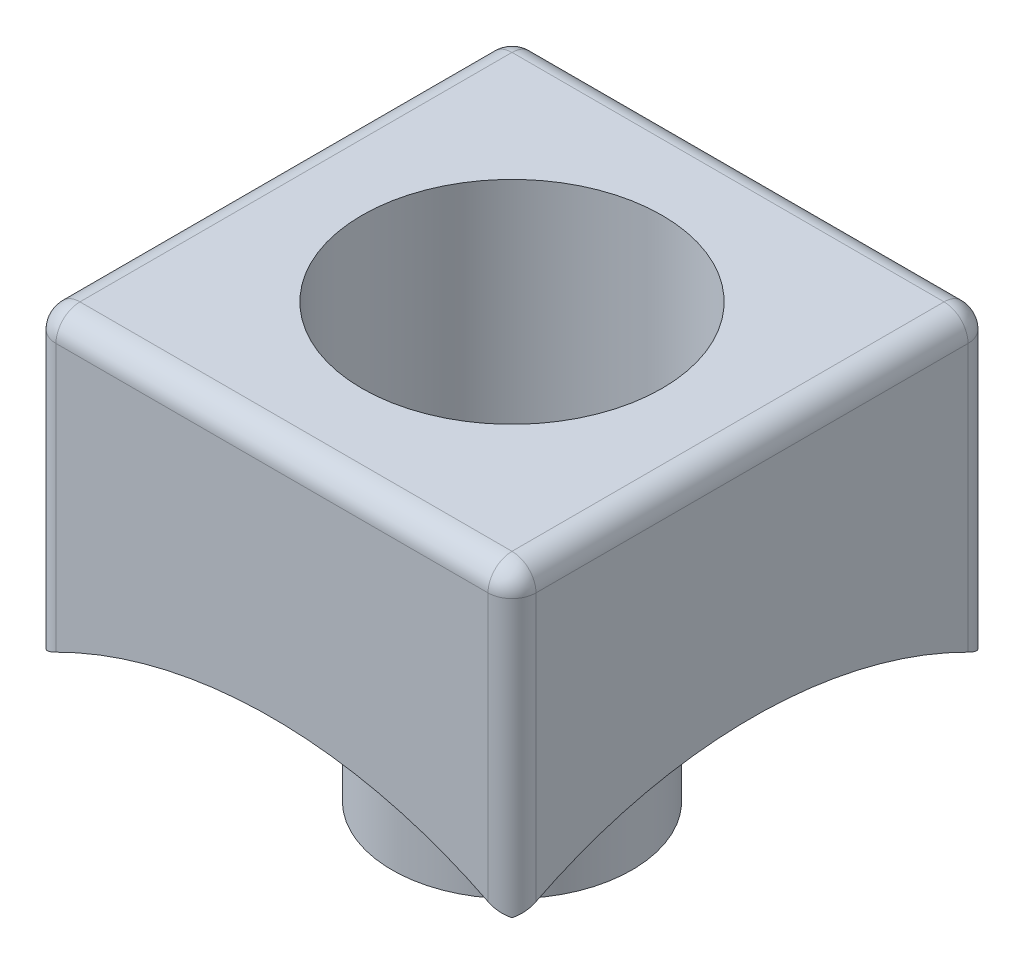
ISO-10303-21;
HEADER;
FILE_DESCRIPTION(('STEP AP214'),'2;1');
FILE_NAME('part.step','',(''),(''),'','','');
FILE_SCHEMA(('AUTOMOTIVE_DESIGN { 1 0 10303 214 1 1 1 1 }'));
ENDSEC;
DATA;
#1=APPLICATION_CONTEXT('core data for automotive mechanical design processes');
#2=APPLICATION_PROTOCOL_DEFINITION('international standard','automotive_design',2000,#1);
#3=PRODUCT_CONTEXT('',#1,'mechanical');
#4=PRODUCT('Part','Part','',(#3));
#5=PRODUCT_RELATED_PRODUCT_CATEGORY('part','',(#4));
#6=PRODUCT_DEFINITION_FORMATION('','',#4);
#7=PRODUCT_DEFINITION_CONTEXT('part definition',#1,'design');
#8=PRODUCT_DEFINITION('design','',#6,#7);
#9=PRODUCT_DEFINITION_SHAPE('','',#8);
#10=(LENGTH_UNIT() NAMED_UNIT(*) SI_UNIT(.MILLI.,.METRE.));
#11=(NAMED_UNIT(*) PLANE_ANGLE_UNIT() SI_UNIT($,.RADIAN.));
#12=(NAMED_UNIT(*) SI_UNIT($,.STERADIAN.) SOLID_ANGLE_UNIT());
#13=UNCERTAINTY_MEASURE_WITH_UNIT(LENGTH_MEASURE(1.E-05),#10,'distance_accuracy_value','');
#14=(GEOMETRIC_REPRESENTATION_CONTEXT(3) GLOBAL_UNCERTAINTY_ASSIGNED_CONTEXT((#13)) GLOBAL_UNIT_ASSIGNED_CONTEXT((#10,
#11,#12)) REPRESENTATION_CONTEXT('',''));
#15=CARTESIAN_POINT('',(0.,0.,0.));
#16=DIRECTION('',(0.,0.,1.));
#17=DIRECTION('',(1.,0.,0.));
#18=AXIS2_PLACEMENT_3D('',#15,#16,#17);
#19=CARTESIAN_POINT('',(0.,-8.00000000000001,0.));
#20=DIRECTION('',(0.,1.,0.));
#21=DIRECTION('',(0.,0.,1.));
#22=AXIS2_PLACEMENT_3D('',#19,#20,#21);
#23=CYLINDRICAL_SURFACE('',#22,7.);
#24=CARTESIAN_POINT('',(0.,8.99999999999999,0.));
#25=DIRECTION('',(0.,-1.,0.));
#26=DIRECTION('',(0.,0.,-1.));
#27=AXIS2_PLACEMENT_3D('',#24,#25,#26);
#28=CIRCLE('',#27,7.);
#29=CARTESIAN_POINT('',(0.,8.99999999999999,-7.));
#30=VERTEX_POINT('',#29);
#31=EDGE_CURVE('E189',#30,#30,#28,.T.);
#32=ORIENTED_EDGE('',*,*,#31,.T.);
#33=EDGE_LOOP('',(#32));
#34=FACE_BOUND('',#33,.T.);
#35=CARTESIAN_POINT('',(0.,-3.00000000000001,0.));
#36=DIRECTION('',(0.,-1.,0.));
#37=DIRECTION('',(0.,0.,-1.));
#38=AXIS2_PLACEMENT_3D('',#35,#36,#37);
#39=CIRCLE('',#38,7.);
#40=CARTESIAN_POINT('',(0.,-3.00000000000001,-7.));
#41=VERTEX_POINT('',#40);
#42=EDGE_CURVE('E210',#41,#41,#39,.T.);
#43=ORIENTED_EDGE('',*,*,#42,.F.);
#44=EDGE_LOOP('',(#43));
#45=FACE_BOUND('',#44,.T.);
#46=ADVANCED_FACE('F34',(#34,#45),#23,.T.);
#47=CARTESIAN_POINT('',(0.,-8.00000000000001,0.));
#48=DIRECTION('',(0.,-1.,0.));
#49=DIRECTION('',(0.,0.,-1.));
#50=AXIS2_PLACEMENT_3D('',#47,#48,#49);
#51=PLANE('',#50);
#52=CARTESIAN_POINT('',(0.,-8.00000000000001,0.));
#53=DIRECTION('',(0.,-1.,0.));
#54=DIRECTION('',(0.,0.,-1.));
#55=AXIS2_PLACEMENT_3D('',#52,#53,#54);
#56=CIRCLE('',#55,3.25);
#57=CARTESIAN_POINT('',(0.,-8.00000000000001,-3.25));
#58=VERTEX_POINT('',#57);
#59=EDGE_CURVE('E499',#58,#58,#56,.T.);
#60=ORIENTED_EDGE('',*,*,#59,.F.);
#61=EDGE_LOOP('',(#60));
#62=FACE_BOUND('',#61,.T.);
#63=CARTESIAN_POINT('',(0.,-8.00000000000001,0.));
#64=DIRECTION('',(0.,-1.,0.));
#65=DIRECTION('',(0.,0.,-1.));
#66=AXIS2_PLACEMENT_3D('',#63,#64,#65);
#67=CIRCLE('',#66,5.);
#68=CARTESIAN_POINT('',(0.,-8.00000000000001,-5.));
#69=VERTEX_POINT('',#68);
#70=EDGE_CURVE('E398',#69,#69,#67,.T.);
#71=ORIENTED_EDGE('',*,*,#70,.T.);
#72=EDGE_LOOP('',(#71));
#73=FACE_BOUND('',#72,.T.);
#74=ADVANCED_FACE('F284',(#62,#73),#51,.T.);
#75=CARTESIAN_POINT('',(10.,9.99999999999999,-10.));
#76=DIRECTION('',(0.,0.,-1.));
#77=DIRECTION('',(-1.,0.,0.));
#78=AXIS2_PLACEMENT_3D('',#75,#76,#77);
#79=PLANE('',#78);
#80=DIRECTION('',(-1.,0.,0.));
#81=VECTOR('',#80,1.);
#82=CARTESIAN_POINT('',(10.,8.99999999999999,-10.));
#83=LINE('',#82,#81);
#84=CARTESIAN_POINT('',(-8.99999999999999,8.99999999999999,-10.));
#85=VERTEX_POINT('',#84);
#86=CARTESIAN_POINT('',(9.00000000000001,8.99999999999999,-10.));
#87=VERTEX_POINT('',#86);
#88=EDGE_CURVE('E221',#85,#87,#83,.F.);
#89=ORIENTED_EDGE('',*,*,#88,.T.);
#90=DIRECTION('',(0.,1.,0.));
#91=VECTOR('',#90,1.);
#92=CARTESIAN_POINT('',(9.00000000000001,-2.67949192431123,-10.));
#93=LINE('',#92,#91);
#94=CARTESIAN_POINT('',(9.00000000000001,-2.13942890050825,-10.));
#95=VERTEX_POINT('',#94);
#96=EDGE_CURVE('E225',#87,#95,#93,.F.);
#97=ORIENTED_EDGE('',*,*,#96,.T.);
#98=CARTESIAN_POINT('',(0.,-20.,-10.));
#99=DIRECTION('',(0.,0.,1.));
#100=DIRECTION('',(1.,0.,0.));
#101=AXIS2_PLACEMENT_3D('',#98,#99,#100);
#102=CIRCLE('',#101,20.);
#103=CARTESIAN_POINT('',(-8.99999999999999,-2.13942890050825,-10.));
#104=VERTEX_POINT('',#103);
#105=EDGE_CURVE('E171',#95,#104,#102,.T.);
#106=ORIENTED_EDGE('',*,*,#105,.T.);
#107=DIRECTION('',(0.,-1.,0.));
#108=VECTOR('',#107,1.);
#109=CARTESIAN_POINT('',(-8.99999999999999,9.99999999999999,-10.));
#110=LINE('',#109,#108);
#111=EDGE_CURVE('E223',#104,#85,#110,.F.);
#112=ORIENTED_EDGE('',*,*,#111,.T.);
#113=EDGE_LOOP('',(#89,#97,#106,#112));
#114=FACE_BOUND('',#113,.T.);
#115=ADVANCED_FACE('F288',(#114),#79,.T.);
#116=CARTESIAN_POINT('',(10.,9.99999999999999,-9.));
#117=DIRECTION('',(0.,0.,-1.));
#118=DIRECTION('',(-1.,0.,0.));
#119=AXIS2_PLACEMENT_3D('',#116,#117,#118);
#120=PLANE('',#119);
#121=CARTESIAN_POINT('',(0.,-20.,-9.));
#122=DIRECTION('',(0.,0.,1.));
#123=DIRECTION('',(1.,0.,0.));
#124=AXIS2_PLACEMENT_3D('',#121,#122,#123);
#125=CIRCLE('',#124,20.);
#126=CARTESIAN_POINT('',(8.99999999999999,-2.13942890050824,-9.));
#127=VERTEX_POINT('',#126);
#128=CARTESIAN_POINT('',(-8.99999999999999,-2.13942890050825,-9.));
#129=VERTEX_POINT('',#128);
#130=EDGE_CURVE('E154',#127,#129,#125,.T.);
#131=ORIENTED_EDGE('',*,*,#130,.F.);
#132=DIRECTION('',(0.,1.,0.));
#133=VECTOR('',#132,1.);
#134=CARTESIAN_POINT('',(9.00000000000001,9.99999999999999,-9.));
#135=LINE('',#134,#133);
#136=CARTESIAN_POINT('',(9.00000000000001,8.99999999999999,-9.));
#137=VERTEX_POINT('',#136);
#138=EDGE_CURVE('E167',#127,#137,#135,.T.);
#139=ORIENTED_EDGE('',*,*,#138,.T.);
#140=DIRECTION('',(-1.,0.,0.));
#141=VECTOR('',#140,1.);
#142=CARTESIAN_POINT('',(10.,8.99999999999999,-9.));
#143=LINE('',#142,#141);
#144=CARTESIAN_POINT('',(-8.99999999999999,8.99999999999999,-9.));
#145=VERTEX_POINT('',#144);
#146=EDGE_CURVE('E188',#137,#145,#143,.T.);
#147=ORIENTED_EDGE('',*,*,#146,.T.);
#148=DIRECTION('',(0.,-1.,0.));
#149=VECTOR('',#148,1.);
#150=CARTESIAN_POINT('',(-8.99999999999999,9.99999999999999,-9.));
#151=LINE('',#150,#149);
#152=EDGE_CURVE('E170',#145,#129,#151,.T.);
#153=ORIENTED_EDGE('',*,*,#152,.T.);
#154=EDGE_LOOP('',(#131,#139,#147,#153));
#155=FACE_BOUND('',#154,.T.);
#156=ADVANCED_FACE('F165',(#155),#120,.F.);
#157=CARTESIAN_POINT('',(-8.99999999999999,-20.,0.));
#158=DIRECTION('',(-1.,0.,0.));
#159=DIRECTION('',(0.,0.,1.));
#160=AXIS2_PLACEMENT_3D('',#157,#158,#159);
#161=CYLINDRICAL_SURFACE('',#160,20.);
#162=CARTESIAN_POINT('',(0.,-20.,0.));
#163=DIRECTION('',(-0.707106781186547,0.,-0.707106781186547));
#164=DIRECTION('',(-0.707106781186547,0.,0.707106781186547));
#165=AXIS2_PLACEMENT_3D('',#162,#163,#164);
#166=ELLIPSE('',#165,28.2842712474619,20.);
#167=CARTESIAN_POINT('',(-8.99999999999999,-2.13942890050825,9.));
#168=VERTEX_POINT('',#167);
#169=CARTESIAN_POINT('',(-9.70710678118654,-2.51366024753488,9.70710678118655));
#170=VERTEX_POINT('',#169);
#171=EDGE_CURVE('E370',#168,#170,#166,.F.);
#172=ORIENTED_EDGE('',*,*,#171,.T.);
#173=CARTESIAN_POINT('',(-9.70710678118654,-2.51366024753486,9.70710678118655));
#174=CARTESIAN_POINT('',(-9.75086160467598,-2.48936640860533,9.66336275060323));
#175=CARTESIAN_POINT('',(-9.78997979575569,-2.46336652195126,9.61612306365357));
#176=CARTESIAN_POINT('',(-9.85854013435416,-2.40900351369542,9.51630002383607));
#177=CARTESIAN_POINT('',(-9.88798663335841,-2.3806414620985,9.46371908808201));
#178=CARTESIAN_POINT('',(-9.93679672235931,-2.32263176723842,9.35491739729838));
#179=CARTESIAN_POINT('',(-9.95617846424611,-2.29298654357576,9.29870340194732));
#180=CARTESIAN_POINT('',(-9.98468200107242,-2.2332562539749,9.18406019139775));
#181=CARTESIAN_POINT('',(-9.99382227351383,-2.20317207968784,9.12563516290671));
#182=CARTESIAN_POINT('',(-9.99925480292988,-2.16195339720166,9.04459700974698));
#183=CARTESIAN_POINT('',(-10.0000019589736,-2.15066702130929,9.02230408613707));
#184=CARTESIAN_POINT('',(-9.99999999999999,-2.13942890050825,9.));
#185=B_SPLINE_CURVE_WITH_KNOTS('',3,(#173,#174,#175,#176,#177,#178,#179,#180,#181,#182,#183,
#184),.UNSPECIFIED.,.F.,.F.,(4,2,2,2,2,4),(0.,0.198958979889588,0.397828321186781,
0.596337742973679,0.794488437508147,0.86943511855196),.UNSPECIFIED.);
#186=CARTESIAN_POINT('',(-9.99999999999999,-2.13942890050825,9.));
#187=VERTEX_POINT('',#186);
#188=EDGE_CURVE('E264',#170,#187,#185,.T.);
#189=ORIENTED_EDGE('',*,*,#188,.T.);
#190=CARTESIAN_POINT('',(-9.99999999999999,-20.,0.));
#191=DIRECTION('',(-1.,0.,0.));
#192=DIRECTION('',(0.,0.,1.));
#193=AXIS2_PLACEMENT_3D('',#190,#191,#192);
#194=CIRCLE('',#193,20.);
#195=CARTESIAN_POINT('',(-9.99999999999999,-2.13942890050825,-9.));
#196=VERTEX_POINT('',#195);
#197=EDGE_CURVE('E181',#187,#196,#194,.T.);
#198=ORIENTED_EDGE('',*,*,#197,.T.);
#199=CARTESIAN_POINT('',(-9.99999999999999,-2.13942890050825,-9.));
#200=CARTESIAN_POINT('',(-10.0000019412703,-2.17146812327706,-9.06361138291914));
#201=CARTESIAN_POINT('',(-9.99392879894998,-2.20386337440279,-9.12702423278765));
#202=CARTESIAN_POINT('',(-9.97024362204474,-2.26740601498298,-9.24984473152507));
#203=CARTESIAN_POINT('',(-9.95297988429877,-2.2985618770495,-9.30931540370141));
#204=CARTESIAN_POINT('',(-9.90597762284806,-2.36171143274543,-9.4284468765389));
#205=CARTESIAN_POINT('',(-9.8754883156671,-2.39362385521701,-9.4878591768244));
#206=CARTESIAN_POINT('',(-9.80133913259112,-2.45571189239321,-9.60221197232428));
#207=CARTESIAN_POINT('',(-9.75728138759686,-2.48579666051533,-9.65694286498286));
#208=CARTESIAN_POINT('',(-9.70710678118655,-2.51366024753487,-9.70710678118654));
#209=B_SPLINE_CURVE_WITH_KNOTS('',3,(#199,#200,#201,#202,#203,#204,#205,#206,#207,#208),
.UNSPECIFIED.,.F.,.F.,(4,2,2,2,4),(0.,0.213384258991516,0.420426797241797,0.641187946816178,
0.869163905662991),.UNSPECIFIED.);
#210=CARTESIAN_POINT('',(-9.70710678118654,-2.51366024753488,-9.70710678118654));
#211=VERTEX_POINT('',#210);
#212=EDGE_CURVE('E256',#196,#211,#209,.T.);
#213=ORIENTED_EDGE('',*,*,#212,.T.);
#214=CARTESIAN_POINT('',(0.,-20.,0.));
#215=DIRECTION('',(-0.707106781186547,0.,0.707106781186547));
#216=DIRECTION('',(-0.707106781186547,0.,-0.707106781186547));
#217=AXIS2_PLACEMENT_3D('',#214,#215,#216);
#218=ELLIPSE('',#217,28.2842712474619,20.);
#219=EDGE_CURVE('E161',#129,#211,#218,.T.);
#220=ORIENTED_EDGE('',*,*,#219,.F.);
#221=CARTESIAN_POINT('',(-8.99999999999999,-20.,0.));
#222=DIRECTION('',(-1.,0.,0.));
#223=DIRECTION('',(0.,0.,1.));
#224=AXIS2_PLACEMENT_3D('',#221,#222,#223);
#225=CIRCLE('',#224,20.);
#226=EDGE_CURVE('E193',#168,#129,#225,.T.);
#227=ORIENTED_EDGE('',*,*,#226,.F.);
#228=EDGE_LOOP('',(#172,#189,#198,#213,#220,#227));
#229=FACE_BOUND('',#228,.T.);
#230=ADVANCED_FACE('F277',(#229),#161,.F.);
#231=CARTESIAN_POINT('',(8.99999999999999,-20.,0.));
#232=DIRECTION('',(1.,0.,0.));
#233=DIRECTION('',(0.,0.,-1.));
#234=AXIS2_PLACEMENT_3D('',#231,#232,#233);
#235=CYLINDRICAL_SURFACE('',#234,20.);
#236=CARTESIAN_POINT('',(0.,-20.,0.));
#237=DIRECTION('',(0.707106781186547,0.,0.707106781186547));
#238=DIRECTION('',(0.707106781186547,0.,-0.707106781186547));
#239=AXIS2_PLACEMENT_3D('',#236,#237,#238);
#240=ELLIPSE('',#239,28.2842712474619,20.);
#241=CARTESIAN_POINT('',(9.70710678118656,-2.51366024753488,-9.70710678118655));
#242=VERTEX_POINT('',#241);
#243=EDGE_CURVE('E149',#127,#242,#240,.F.);
#244=ORIENTED_EDGE('',*,*,#243,.T.);
#245=CARTESIAN_POINT('',(9.70710678118656,-2.51366024753488,-9.70710678118655));
#246=CARTESIAN_POINT('',(9.75086160467599,-2.48936640860533,-9.66336275060324));
#247=CARTESIAN_POINT('',(9.7899797957557,-2.46336652195126,-9.61612306365358));
#248=CARTESIAN_POINT('',(9.85854013435416,-2.40900351369542,-9.51630002383608));
#249=CARTESIAN_POINT('',(9.88798663335842,-2.3806414620985,-9.46371908808202));
#250=CARTESIAN_POINT('',(9.93679672235933,-2.32263176723842,-9.35491739729839));
#251=CARTESIAN_POINT('',(9.95617846424612,-2.29298654357577,-9.29870340194733));
#252=CARTESIAN_POINT('',(9.98468200107244,-2.23325625397491,-9.18406019139776));
#253=CARTESIAN_POINT('',(9.99382227351384,-2.20317207968784,-9.12563516290672));
#254=CARTESIAN_POINT('',(9.9992548029299,-2.16195339720166,-9.04459700974699));
#255=CARTESIAN_POINT('',(10.0000019589736,-2.15066702130929,-9.02230408613707));
#256=CARTESIAN_POINT('',(10.,-2.13942890050825,-9.));
#257=B_SPLINE_CURVE_WITH_KNOTS('',3,(#245,#246,#247,#248,#249,#250,#251,#252,#253,#254,#255,
#256),.UNSPECIFIED.,.F.,.F.,(4,2,2,2,2,4),(0.,0.198958979889587,0.397828321186782,
0.596337742973681,0.79448843750815,0.869435118551966),.UNSPECIFIED.);
#258=CARTESIAN_POINT('',(9.99999999999999,-2.13942890050825,-9.));
#259=VERTEX_POINT('',#258);
#260=EDGE_CURVE('E336',#242,#259,#257,.T.);
#261=ORIENTED_EDGE('',*,*,#260,.T.);
#262=CARTESIAN_POINT('',(9.99999999999999,-20.,0.));
#263=DIRECTION('',(-1.,0.,0.));
#264=DIRECTION('',(0.,0.,1.));
#265=AXIS2_PLACEMENT_3D('',#262,#263,#264);
#266=CIRCLE('',#265,20.);
#267=CARTESIAN_POINT('',(9.99999999999999,-2.13942890050825,9.));
#268=VERTEX_POINT('',#267);
#269=EDGE_CURVE('E182',#268,#259,#266,.T.);
#270=ORIENTED_EDGE('',*,*,#269,.F.);
#271=CARTESIAN_POINT('',(10.,-2.13942890050825,9.));
#272=CARTESIAN_POINT('',(10.0000019412703,-2.17146812327705,9.06361138291914));
#273=CARTESIAN_POINT('',(9.99392879894999,-2.20386337440278,9.12702423278765));
#274=CARTESIAN_POINT('',(9.97024362204475,-2.26740601498298,9.24984473152507));
#275=CARTESIAN_POINT('',(9.95297988429878,-2.2985618770495,9.30931540370141));
#276=CARTESIAN_POINT('',(9.90597762284808,-2.36171143274543,9.4284468765389));
#277=CARTESIAN_POINT('',(9.87548831566711,-2.39362385521701,9.4878591768244));
#278=CARTESIAN_POINT('',(9.80133913259113,-2.4557118923932,9.60221197232428));
#279=CARTESIAN_POINT('',(9.75728138759687,-2.48579666051533,9.65694286498286));
#280=CARTESIAN_POINT('',(9.70710678118655,-2.51366024753487,9.70710678118655));
#281=B_SPLINE_CURVE_WITH_KNOTS('',3,(#271,#272,#273,#274,#275,#276,#277,#278,#279,#280),
.UNSPECIFIED.,.F.,.F.,(4,2,2,2,4),(0.,0.213384258991516,0.420426797241796,0.641187946816183,
0.869163905663004),.UNSPECIFIED.);
#282=CARTESIAN_POINT('',(9.70710678118654,-2.51366024753488,9.70710678118654));
#283=VERTEX_POINT('',#282);
#284=EDGE_CURVE('E343',#268,#283,#281,.T.);
#285=ORIENTED_EDGE('',*,*,#284,.T.);
#286=CARTESIAN_POINT('',(0.,-20.,0.));
#287=DIRECTION('',(0.707106781186547,0.,-0.707106781186547));
#288=DIRECTION('',(0.707106781186547,0.,0.707106781186547));
#289=AXIS2_PLACEMENT_3D('',#286,#287,#288);
#290=ELLIPSE('',#289,28.2842712474619,20.);
#291=CARTESIAN_POINT('',(8.99999999999999,-2.13942890050825,9.));
#292=VERTEX_POINT('',#291);
#293=EDGE_CURVE('E178',#292,#283,#290,.T.);
#294=ORIENTED_EDGE('',*,*,#293,.F.);
#295=CARTESIAN_POINT('',(8.99999999999999,-20.,0.));
#296=DIRECTION('',(-1.,0.,0.));
#297=DIRECTION('',(0.,0.,1.));
#298=AXIS2_PLACEMENT_3D('',#295,#296,#297);
#299=CIRCLE('',#298,20.);
#300=EDGE_CURVE('E175',#292,#127,#299,.T.);
#301=ORIENTED_EDGE('',*,*,#300,.T.);
#302=EDGE_LOOP('',(#244,#261,#270,#285,#294,#301));
#303=FACE_BOUND('',#302,.T.);
#304=ADVANCED_FACE('F176',(#303),#235,.F.);
#305=CARTESIAN_POINT('',(10.,-10.,10.));
#306=DIRECTION('',(-1.,0.,0.));
#307=DIRECTION('',(0.,0.,1.));
#308=AXIS2_PLACEMENT_3D('',#305,#306,#307);
#309=PLANE('',#308);
#310=ORIENTED_EDGE('',*,*,#269,.T.);
#311=DIRECTION('',(0.,1.,0.));
#312=VECTOR('',#311,1.);
#313=CARTESIAN_POINT('',(10.,9.99999999999999,-9.));
#314=LINE('',#313,#312);
#315=CARTESIAN_POINT('',(10.,8.99999999999999,-9.));
#316=VERTEX_POINT('',#315);
#317=EDGE_CURVE('E218',#259,#316,#314,.T.);
#318=ORIENTED_EDGE('',*,*,#317,.T.);
#319=DIRECTION('',(0.,0.,-1.));
#320=VECTOR('',#319,1.);
#321=CARTESIAN_POINT('',(10.,8.99999999999999,10.));
#322=LINE('',#321,#320);
#323=CARTESIAN_POINT('',(10.,8.99999999999999,9.));
#324=VERTEX_POINT('',#323);
#325=EDGE_CURVE('E198',#316,#324,#322,.F.);
#326=ORIENTED_EDGE('',*,*,#325,.T.);
#327=DIRECTION('',(0.,1.,0.));
#328=VECTOR('',#327,1.);
#329=CARTESIAN_POINT('',(10.,-10.,9.));
#330=LINE('',#329,#328);
#331=EDGE_CURVE('E216',#324,#268,#330,.F.);
#332=ORIENTED_EDGE('',*,*,#331,.T.);
#333=EDGE_LOOP('',(#310,#318,#326,#332));
#334=FACE_BOUND('',#333,.T.);
#335=ADVANCED_FACE('F315',(#334),#309,.F.);
#336=CARTESIAN_POINT('',(10.,9.99999999999999,10.));
#337=DIRECTION('',(0.,0.,-1.));
#338=DIRECTION('',(-1.,0.,0.));
#339=AXIS2_PLACEMENT_3D('',#336,#337,#338);
#340=PLANE('',#339);
#341=CARTESIAN_POINT('',(0.,-20.,10.));
#342=DIRECTION('',(0.,0.,1.));
#343=DIRECTION('',(1.,0.,0.));
#344=AXIS2_PLACEMENT_3D('',#341,#342,#343);
#345=CIRCLE('',#344,20.);
#346=CARTESIAN_POINT('',(9.00000000000001,-2.13942890050825,10.));
#347=VERTEX_POINT('',#346);
#348=CARTESIAN_POINT('',(-8.99999999999999,-2.13942890050825,10.));
#349=VERTEX_POINT('',#348);
#350=EDGE_CURVE('E383',#347,#349,#345,.T.);
#351=ORIENTED_EDGE('',*,*,#350,.F.);
#352=DIRECTION('',(0.,1.,0.));
#353=VECTOR('',#352,1.);
#354=CARTESIAN_POINT('',(9.00000000000001,9.99999999999999,10.));
#355=LINE('',#354,#353);
#356=CARTESIAN_POINT('',(9.00000000000001,8.99999999999999,10.));
#357=VERTEX_POINT('',#356);
#358=EDGE_CURVE('E351',#347,#357,#355,.T.);
#359=ORIENTED_EDGE('',*,*,#358,.T.);
#360=DIRECTION('',(-1.,0.,0.));
#361=VECTOR('',#360,1.);
#362=CARTESIAN_POINT('',(10.,8.99999999999999,10.));
#363=LINE('',#362,#361);
#364=CARTESIAN_POINT('',(-8.99999999999999,8.99999999999999,10.));
#365=VERTEX_POINT('',#364);
#366=EDGE_CURVE('E342',#357,#365,#363,.T.);
#367=ORIENTED_EDGE('',*,*,#366,.T.);
#368=DIRECTION('',(0.,-1.,0.));
#369=VECTOR('',#368,1.);
#370=CARTESIAN_POINT('',(-8.99999999999999,9.99999999999999,10.));
#371=LINE('',#370,#369);
#372=EDGE_CURVE('E349',#365,#349,#371,.T.);
#373=ORIENTED_EDGE('',*,*,#372,.T.);
#374=EDGE_LOOP('',(#351,#359,#367,#373));
#375=FACE_BOUND('',#374,.T.);
#376=ADVANCED_FACE('F296',(#375),#340,.F.);
#377=CARTESIAN_POINT('',(9.00000000000001,-10.,10.));
#378=DIRECTION('',(-1.,0.,0.));
#379=DIRECTION('',(0.,0.,1.));
#380=AXIS2_PLACEMENT_3D('',#377,#378,#379);
#381=PLANE('',#380);
#382=ORIENTED_EDGE('',*,*,#138,.F.);
#383=ORIENTED_EDGE('',*,*,#300,.F.);
#384=DIRECTION('',(0.,1.,0.));
#385=VECTOR('',#384,1.);
#386=CARTESIAN_POINT('',(9.00000000000001,9.99999999999999,9.));
#387=LINE('',#386,#385);
#388=CARTESIAN_POINT('',(9.00000000000001,8.99999999999999,9.));
#389=VERTEX_POINT('',#388);
#390=EDGE_CURVE('E200',#292,#389,#387,.T.);
#391=ORIENTED_EDGE('',*,*,#390,.T.);
#392=DIRECTION('',(0.,0.,-1.));
#393=VECTOR('',#392,1.);
#394=CARTESIAN_POINT('',(9.00000000000001,8.99999999999999,10.));
#395=LINE('',#394,#393);
#396=EDGE_CURVE('E187',#389,#137,#395,.T.);
#397=ORIENTED_EDGE('',*,*,#396,.T.);
#398=EDGE_LOOP('',(#382,#383,#391,#397));
#399=FACE_BOUND('',#398,.T.);
#400=ADVANCED_FACE('F185',(#399),#381,.T.);
#401=CARTESIAN_POINT('',(-9.99999999999999,8.99999999999999,10.));
#402=DIRECTION('',(0.,-1.,0.));
#403=DIRECTION('',(0.,0.,-1.));
#404=AXIS2_PLACEMENT_3D('',#401,#402,#403);
#405=PLANE('',#404);
#406=ORIENTED_EDGE('',*,*,#146,.F.);
#407=ORIENTED_EDGE('',*,*,#396,.F.);
#408=DIRECTION('',(-1.,0.,0.));
#409=VECTOR('',#408,1.);
#410=CARTESIAN_POINT('',(10.,8.99999999999999,9.));
#411=LINE('',#410,#409);
#412=CARTESIAN_POINT('',(-8.99999999999999,8.99999999999999,9.));
#413=VERTEX_POINT('',#412);
#414=EDGE_CURVE('E201',#389,#413,#411,.T.);
#415=ORIENTED_EDGE('',*,*,#414,.T.);
#416=DIRECTION('',(0.,0.,-1.));
#417=VECTOR('',#416,1.);
#418=CARTESIAN_POINT('',(-8.99999999999999,8.99999999999999,10.));
#419=LINE('',#418,#417);
#420=EDGE_CURVE('E199',#413,#145,#419,.T.);
#421=ORIENTED_EDGE('',*,*,#420,.T.);
#422=EDGE_LOOP('',(#406,#407,#415,#421));
#423=FACE_BOUND('',#422,.T.);
#424=ORIENTED_EDGE('',*,*,#31,.F.);
#425=EDGE_LOOP('',(#424));
#426=FACE_BOUND('',#425,.T.);
#427=ADVANCED_FACE('F295',(#423,#426),#405,.T.);
#428=CARTESIAN_POINT('',(-9.99999999999999,9.99999999999999,10.));
#429=DIRECTION('',(0.,-1.,0.));
#430=DIRECTION('',(0.,0.,-1.));
#431=AXIS2_PLACEMENT_3D('',#428,#429,#430);
#432=PLANE('',#431);
#433=DIRECTION('',(0.,0.,-1.));
#434=VECTOR('',#433,1.);
#435=CARTESIAN_POINT('',(9.00000000000001,9.99999999999999,10.));
#436=LINE('',#435,#434);
#437=CARTESIAN_POINT('',(9.00000000000001,9.99999999999999,9.));
#438=VERTEX_POINT('',#437);
#439=CARTESIAN_POINT('',(9.00000000000001,9.99999999999999,-9.));
#440=VERTEX_POINT('',#439);
#441=EDGE_CURVE('E44',#438,#440,#436,.T.);
#442=ORIENTED_EDGE('',*,*,#441,.T.);
#443=DIRECTION('',(-1.,0.,0.));
#444=VECTOR('',#443,1.);
#445=CARTESIAN_POINT('',(-9.99999999999999,9.99999999999999,-9.));
#446=LINE('',#445,#444);
#447=CARTESIAN_POINT('',(-8.99999999999999,9.99999999999999,-9.));
#448=VERTEX_POINT('',#447);
#449=EDGE_CURVE('E11',#440,#448,#446,.T.);
#450=ORIENTED_EDGE('',*,*,#449,.T.);
#451=DIRECTION('',(0.,0.,-1.));
#452=VECTOR('',#451,1.);
#453=CARTESIAN_POINT('',(-8.99999999999999,9.99999999999999,10.));
#454=LINE('',#453,#452);
#455=CARTESIAN_POINT('',(-8.99999999999999,9.99999999999999,9.));
#456=VERTEX_POINT('',#455);
#457=EDGE_CURVE('E422',#448,#456,#454,.F.);
#458=ORIENTED_EDGE('',*,*,#457,.T.);
#459=DIRECTION('',(-1.,0.,0.));
#460=VECTOR('',#459,1.);
#461=CARTESIAN_POINT('',(-9.99999999999999,9.99999999999999,9.));
#462=LINE('',#461,#460);
#463=EDGE_CURVE('E393',#456,#438,#462,.F.);
#464=ORIENTED_EDGE('',*,*,#463,.T.);
#465=EDGE_LOOP('',(#442,#450,#458,#464));
#466=FACE_BOUND('',#465,.T.);
#467=CARTESIAN_POINT('',(0.,9.99999999999999,0.));
#468=DIRECTION('',(0.,1.,0.));
#469=DIRECTION('',(0.,0.,1.));
#470=AXIS2_PLACEMENT_3D('',#467,#468,#469);
#471=CIRCLE('',#470,6.25);
#472=CARTESIAN_POINT('',(0.,9.99999999999999,6.25));
#473=VERTEX_POINT('',#472);
#474=EDGE_CURVE('E497',#473,#473,#471,.T.);
#475=ORIENTED_EDGE('',*,*,#474,.F.);
#476=EDGE_LOOP('',(#475));
#477=FACE_BOUND('',#476,.T.);
#478=ADVANCED_FACE('F299',(#466,#477),#432,.F.);
#479=CARTESIAN_POINT('',(-9.99999999999999,-10.,10.));
#480=DIRECTION('',(1.,0.,0.));
#481=DIRECTION('',(0.,0.,-1.));
#482=AXIS2_PLACEMENT_3D('',#479,#480,#481);
#483=PLANE('',#482);
#484=ORIENTED_EDGE('',*,*,#197,.F.);
#485=DIRECTION('',(0.,-1.,0.));
#486=VECTOR('',#485,1.);
#487=CARTESIAN_POINT('',(-9.99999999999999,-10.,9.));
#488=LINE('',#487,#486);
#489=CARTESIAN_POINT('',(-9.99999999999999,8.99999999999999,9.));
#490=VERTEX_POINT('',#489);
#491=EDGE_CURVE('E425',#187,#490,#488,.F.);
#492=ORIENTED_EDGE('',*,*,#491,.T.);
#493=DIRECTION('',(0.,0.,-1.));
#494=VECTOR('',#493,1.);
#495=CARTESIAN_POINT('',(-9.99999999999999,8.99999999999999,10.));
#496=LINE('',#495,#494);
#497=CARTESIAN_POINT('',(-9.99999999999999,8.99999999999999,-9.));
#498=VERTEX_POINT('',#497);
#499=EDGE_CURVE('E428',#490,#498,#496,.T.);
#500=ORIENTED_EDGE('',*,*,#499,.T.);
#501=DIRECTION('',(0.,-1.,0.));
#502=VECTOR('',#501,1.);
#503=CARTESIAN_POINT('',(-9.99999999999999,-2.67949192431123,-9.));
#504=LINE('',#503,#502);
#505=EDGE_CURVE('E427',#498,#196,#504,.T.);
#506=ORIENTED_EDGE('',*,*,#505,.T.);
#507=EDGE_LOOP('',(#484,#492,#500,#506));
#508=FACE_BOUND('',#507,.T.);
#509=ADVANCED_FACE('F305',(#508),#483,.F.);
#510=CARTESIAN_POINT('',(-8.99999999999999,-10.,10.));
#511=DIRECTION('',(1.,0.,0.));
#512=DIRECTION('',(0.,0.,-1.));
#513=AXIS2_PLACEMENT_3D('',#510,#511,#512);
#514=PLANE('',#513);
#515=ORIENTED_EDGE('',*,*,#226,.T.);
#516=ORIENTED_EDGE('',*,*,#152,.F.);
#517=ORIENTED_EDGE('',*,*,#420,.F.);
#518=DIRECTION('',(0.,-1.,0.));
#519=VECTOR('',#518,1.);
#520=CARTESIAN_POINT('',(-8.99999999999999,9.99999999999999,9.));
#521=LINE('',#520,#519);
#522=EDGE_CURVE('E205',#413,#168,#521,.T.);
#523=ORIENTED_EDGE('',*,*,#522,.T.);
#524=EDGE_LOOP('',(#515,#516,#517,#523));
#525=FACE_BOUND('',#524,.T.);
#526=ADVANCED_FACE('F301',(#525),#514,.T.);
#527=CARTESIAN_POINT('',(10.,9.99999999999999,9.));
#528=DIRECTION('',(0.,0.,-1.));
#529=DIRECTION('',(-1.,0.,0.));
#530=AXIS2_PLACEMENT_3D('',#527,#528,#529);
#531=PLANE('',#530);
#532=CARTESIAN_POINT('',(0.,-20.,9.));
#533=DIRECTION('',(0.,0.,1.));
#534=DIRECTION('',(1.,0.,0.));
#535=AXIS2_PLACEMENT_3D('',#532,#533,#534);
#536=CIRCLE('',#535,20.);
#537=EDGE_CURVE('E369',#292,#168,#536,.T.);
#538=ORIENTED_EDGE('',*,*,#537,.T.);
#539=ORIENTED_EDGE('',*,*,#522,.F.);
#540=ORIENTED_EDGE('',*,*,#414,.F.);
#541=ORIENTED_EDGE('',*,*,#390,.F.);
#542=EDGE_LOOP('',(#538,#539,#540,#541));
#543=FACE_BOUND('',#542,.T.);
#544=ADVANCED_FACE('F304',(#543),#531,.T.);
#545=CARTESIAN_POINT('',(0.,-20.,9.));
#546=DIRECTION('',(0.,0.,1.));
#547=DIRECTION('',(1.,0.,0.));
#548=AXIS2_PLACEMENT_3D('',#545,#546,#547);
#549=CYLINDRICAL_SURFACE('',#548,20.);
#550=ORIENTED_EDGE('',*,*,#293,.T.);
#551=CARTESIAN_POINT('',(9.70710678118655,-2.51366024753487,9.70710678118655));
#552=CARTESIAN_POINT('',(9.66336275060324,-2.48936640860533,9.75086160467599));
#553=CARTESIAN_POINT('',(9.61612306365358,-2.46336652195126,9.78997979575569));
#554=CARTESIAN_POINT('',(9.51630002383608,-2.40900351369542,9.85854013435416));
#555=CARTESIAN_POINT('',(9.46371908808202,-2.3806414620985,9.88798663335841));
#556=CARTESIAN_POINT('',(9.35491739729839,-2.32263176723842,9.93679672235932));
#557=CARTESIAN_POINT('',(9.29870340194733,-2.29298654357576,9.95617846424612));
#558=CARTESIAN_POINT('',(9.18406019139776,-2.2332562539749,9.98468200107243));
#559=CARTESIAN_POINT('',(9.12563516290671,-2.20317207968784,9.99382227351384));
#560=CARTESIAN_POINT('',(9.04459700974699,-2.16195339720166,9.99925480292989));
#561=CARTESIAN_POINT('',(9.02230408613708,-2.15066702130929,10.0000019589736));
#562=CARTESIAN_POINT('',(9.00000000000001,-2.13942890050825,10.));
#563=B_SPLINE_CURVE_WITH_KNOTS('',3,(#551,#552,#553,#554,#555,#556,#557,#558,#559,#560,#561,
#562),.UNSPECIFIED.,.F.,.F.,(4,2,2,2,2,4),(0.,0.198958979889587,0.397828321186783,
0.596337742973681,0.794488437508151,0.869435118551959),.UNSPECIFIED.);
#564=EDGE_CURVE('E265',#283,#347,#563,.T.);
#565=ORIENTED_EDGE('',*,*,#564,.T.);
#566=ORIENTED_EDGE('',*,*,#350,.T.);
#567=CARTESIAN_POINT('',(-8.99999999999999,-2.13942890050825,10.));
#568=CARTESIAN_POINT('',(-9.06361138291914,-2.17146812327705,10.0000019412703));
#569=CARTESIAN_POINT('',(-9.12702423278764,-2.20386337440278,9.99392879894999));
#570=CARTESIAN_POINT('',(-9.24984473152507,-2.26740601498298,9.97024362204474));
#571=CARTESIAN_POINT('',(-9.3093154037014,-2.2985618770495,9.95297988429878));
#572=CARTESIAN_POINT('',(-9.42844687653889,-2.36171143274543,9.90597762284807));
#573=CARTESIAN_POINT('',(-9.48785917682439,-2.39362385521701,9.87548831566711));
#574=CARTESIAN_POINT('',(-9.60221197232427,-2.45571189239321,9.80133913259113));
#575=CARTESIAN_POINT('',(-9.65694286498285,-2.48579666051533,9.75728138759687));
#576=CARTESIAN_POINT('',(-9.70710678118654,-2.51366024753487,9.70710678118655));
#577=B_SPLINE_CURVE_WITH_KNOTS('',3,(#567,#568,#569,#570,#571,#572,#573,#574,#575,#576),
.UNSPECIFIED.,.F.,.F.,(4,2,2,2,4),(0.,0.213384258991515,0.420426797241797,0.641187946816179,
0.869163905662996),.UNSPECIFIED.);
#578=EDGE_CURVE('E352',#349,#170,#577,.T.);
#579=ORIENTED_EDGE('',*,*,#578,.T.);
#580=ORIENTED_EDGE('',*,*,#171,.F.);
#581=ORIENTED_EDGE('',*,*,#537,.F.);
#582=EDGE_LOOP('',(#550,#565,#566,#579,#580,#581));
#583=FACE_BOUND('',#582,.T.);
#584=ADVANCED_FACE('F309',(#583),#549,.F.);
#585=CARTESIAN_POINT('',(0.,-20.,-9.));
#586=DIRECTION('',(0.,0.,-1.));
#587=DIRECTION('',(-1.,0.,0.));
#588=AXIS2_PLACEMENT_3D('',#585,#586,#587);
#589=CYLINDRICAL_SURFACE('',#588,20.);
#590=ORIENTED_EDGE('',*,*,#105,.F.);
#591=CARTESIAN_POINT('',(9.00000000000001,-2.13942890050825,-10.));
#592=CARTESIAN_POINT('',(9.06361138291915,-2.17146812327706,-10.0000019412703));
#593=CARTESIAN_POINT('',(9.12702423278765,-2.20386337440279,-9.99392879894999));
#594=CARTESIAN_POINT('',(9.24984473152508,-2.26740601498298,-9.97024362204475));
#595=CARTESIAN_POINT('',(9.30931540370141,-2.2985618770495,-9.95297988429878));
#596=CARTESIAN_POINT('',(9.4284468765389,-2.36171143274543,-9.90597762284807));
#597=CARTESIAN_POINT('',(9.4878591768244,-2.39362385521701,-9.87548831566711));
#598=CARTESIAN_POINT('',(9.60221197232429,-2.45571189239321,-9.80133913259113));
#599=CARTESIAN_POINT('',(9.65694286498287,-2.48579666051534,-9.75728138759687));
#600=CARTESIAN_POINT('',(9.70710678118656,-2.51366024753488,-9.70710678118655));
#601=B_SPLINE_CURVE_WITH_KNOTS('',3,(#591,#592,#593,#594,#595,#596,#597,#598,#599,#600),
.UNSPECIFIED.,.F.,.F.,(4,2,2,2,4),(0.,0.213384258991515,0.420426797241796,0.64118794681618,
0.869163905662999),.UNSPECIFIED.);
#602=EDGE_CURVE('E157',#95,#242,#601,.T.);
#603=ORIENTED_EDGE('',*,*,#602,.T.);
#604=ORIENTED_EDGE('',*,*,#243,.F.);
#605=ORIENTED_EDGE('',*,*,#130,.T.);
#606=ORIENTED_EDGE('',*,*,#219,.T.);
#607=CARTESIAN_POINT('',(-9.70710678118655,-2.51366024753487,-9.70710678118655));
#608=CARTESIAN_POINT('',(-9.66336275060323,-2.48936640860533,-9.75086160467598));
#609=CARTESIAN_POINT('',(-9.61612306365358,-2.46336652195126,-9.78997979575569));
#610=CARTESIAN_POINT('',(-9.51630002383607,-2.40900351369541,-9.85854013435416));
#611=CARTESIAN_POINT('',(-9.46371908808201,-2.3806414620985,-9.88798663335841));
#612=CARTESIAN_POINT('',(-9.35491739729838,-2.32263176723842,-9.93679672235932));
#613=CARTESIAN_POINT('',(-9.29870340194732,-2.29298654357576,-9.95617846424612));
#614=CARTESIAN_POINT('',(-9.18406019139775,-2.2332562539749,-9.98468200107243));
#615=CARTESIAN_POINT('',(-9.12563516290671,-2.20317207968784,-9.99382227351384));
#616=CARTESIAN_POINT('',(-9.04459700974698,-2.16195339720166,-9.99925480292989));
#617=CARTESIAN_POINT('',(-9.02230408613707,-2.15066702130929,-10.0000019589736));
#618=CARTESIAN_POINT('',(-8.99999999999999,-2.13942890050825,-10.));
#619=B_SPLINE_CURVE_WITH_KNOTS('',3,(#607,#608,#609,#610,#611,#612,#613,#614,#615,#616,#617,
#618),.UNSPECIFIED.,.F.,.F.,(4,2,2,2,2,4),(0.,0.198958979889587,0.397828321186783,
0.596337742973684,0.79448843750815,0.86943511855197),.UNSPECIFIED.);
#620=EDGE_CURVE('E227',#211,#104,#619,.T.);
#621=ORIENTED_EDGE('',*,*,#620,.T.);
#622=EDGE_LOOP('',(#590,#603,#604,#605,#606,#621));
#623=FACE_BOUND('',#622,.T.);
#624=ADVANCED_FACE('F152',(#623),#589,.F.);
#625=CARTESIAN_POINT('',(0.,-2.00000000000001,0.));
#626=DIRECTION('',(0.,1.,0.));
#627=DIRECTION('',(0.,0.,1.));
#628=AXIS2_PLACEMENT_3D('',#625,#626,#627);
#629=CYLINDRICAL_SURFACE('',#628,6.25);
#630=CARTESIAN_POINT('',(0.,-2.00000000000001,0.));
#631=DIRECTION('',(0.,1.,0.));
#632=DIRECTION('',(0.,0.,1.));
#633=AXIS2_PLACEMENT_3D('',#630,#631,#632);
#634=CIRCLE('',#633,6.25);
#635=CARTESIAN_POINT('',(0.,-2.00000000000001,6.25));
#636=VERTEX_POINT('',#635);
#637=EDGE_CURVE('E494',#636,#636,#634,.T.);
#638=ORIENTED_EDGE('',*,*,#637,.F.);
#639=EDGE_LOOP('',(#638));
#640=FACE_BOUND('',#639,.T.);
#641=ORIENTED_EDGE('',*,*,#474,.T.);
#642=EDGE_LOOP('',(#641));
#643=FACE_BOUND('',#642,.T.);
#644=ADVANCED_FACE('F364',(#640,#643),#629,.F.);
#645=CARTESIAN_POINT('',(0.,-2.00000000000001,0.));
#646=DIRECTION('',(0.,1.,0.));
#647=DIRECTION('',(0.,0.,1.));
#648=AXIS2_PLACEMENT_3D('',#645,#646,#647);
#649=PLANE('',#648);
#650=CARTESIAN_POINT('',(0.,-2.00000000000001,0.));
#651=DIRECTION('',(0.,1.,0.));
#652=DIRECTION('',(0.,0.,1.));
#653=AXIS2_PLACEMENT_3D('',#650,#651,#652);
#654=CIRCLE('',#653,3.25);
#655=CARTESIAN_POINT('',(0.,-2.00000000000001,3.25));
#656=VERTEX_POINT('',#655);
#657=EDGE_CURVE('E213',#656,#656,#654,.T.);
#658=ORIENTED_EDGE('',*,*,#657,.F.);
#659=EDGE_LOOP('',(#658));
#660=FACE_BOUND('',#659,.T.);
#661=ORIENTED_EDGE('',*,*,#637,.T.);
#662=EDGE_LOOP('',(#661));
#663=FACE_BOUND('',#662,.T.);
#664=ADVANCED_FACE('F480',(#660,#663),#649,.T.);
#665=CARTESIAN_POINT('',(0.,-12.,0.));
#666=DIRECTION('',(0.,1.,0.));
#667=DIRECTION('',(0.,0.,1.));
#668=AXIS2_PLACEMENT_3D('',#665,#666,#667);
#669=CYLINDRICAL_SURFACE('',#668,3.25);
#670=ORIENTED_EDGE('',*,*,#59,.T.);
#671=EDGE_LOOP('',(#670));
#672=FACE_BOUND('',#671,.T.);
#673=ORIENTED_EDGE('',*,*,#657,.T.);
#674=EDGE_LOOP('',(#673));
#675=FACE_BOUND('',#674,.T.);
#676=ADVANCED_FACE('F471',(#672,#675),#669,.F.);
#677=CARTESIAN_POINT('',(0.,-3.00000000000001,0.));
#678=DIRECTION('',(0.,-1.,0.));
#679=DIRECTION('',(0.,0.,-1.));
#680=AXIS2_PLACEMENT_3D('',#677,#678,#679);
#681=PLANE('',#680);
#682=CARTESIAN_POINT('',(0.,-3.00000000000001,0.));
#683=DIRECTION('',(0.,-1.,0.));
#684=DIRECTION('',(0.,0.,-1.));
#685=AXIS2_PLACEMENT_3D('',#682,#683,#684);
#686=CIRCLE('',#685,5.);
#687=CARTESIAN_POINT('',(0.,-3.00000000000001,-5.));
#688=VERTEX_POINT('',#687);
#689=EDGE_CURVE('E214',#688,#688,#686,.T.);
#690=ORIENTED_EDGE('',*,*,#689,.F.);
#691=EDGE_LOOP('',(#690));
#692=FACE_BOUND('',#691,.T.);
#693=ORIENTED_EDGE('',*,*,#42,.T.);
#694=EDGE_LOOP('',(#693));
#695=FACE_BOUND('',#694,.T.);
#696=ADVANCED_FACE('F468',(#692,#695),#681,.T.);
#697=CARTESIAN_POINT('',(0.,-3.00000000000001,0.));
#698=DIRECTION('',(0.,-1.,0.));
#699=DIRECTION('',(0.,0.,-1.));
#700=AXIS2_PLACEMENT_3D('',#697,#698,#699);
#701=CYLINDRICAL_SURFACE('',#700,5.);
#702=ORIENTED_EDGE('',*,*,#689,.T.);
#703=EDGE_LOOP('',(#702));
#704=FACE_BOUND('',#703,.T.);
#705=ORIENTED_EDGE('',*,*,#70,.F.);
#706=EDGE_LOOP('',(#705));
#707=FACE_BOUND('',#706,.T.);
#708=ADVANCED_FACE('F470',(#704,#707),#701,.T.);
#709=CARTESIAN_POINT('',(-8.99999999999999,9.99999999999999,9.));
#710=DIRECTION('',(0.,-1.,0.));
#711=DIRECTION('',(0.,0.,-1.));
#712=AXIS2_PLACEMENT_3D('',#709,#710,#711);
#713=CYLINDRICAL_SURFACE('',#712,1.);
#714=CARTESIAN_POINT('',(-8.99999999999999,8.99999999999999,9.));
#715=DIRECTION('',(0.,1.,0.));
#716=DIRECTION('',(0.,0.,1.));
#717=AXIS2_PLACEMENT_3D('',#714,#715,#716);
#718=CIRCLE('',#717,1.);
#719=EDGE_CURVE('E39',#490,#365,#718,.T.);
#720=ORIENTED_EDGE('',*,*,#719,.F.);
#721=ORIENTED_EDGE('',*,*,#491,.F.);
#722=ORIENTED_EDGE('',*,*,#188,.F.);
#723=ORIENTED_EDGE('',*,*,#578,.F.);
#724=ORIENTED_EDGE('',*,*,#372,.F.);
#725=EDGE_LOOP('',(#720,#721,#722,#723,#724));
#726=FACE_BOUND('',#725,.T.);
#727=ADVANCED_FACE('F36',(#726),#713,.T.);
#728=CARTESIAN_POINT('',(-8.99999999999999,8.99999999999999,9.));
#729=DIRECTION('',(0.,0.,1.));
#730=DIRECTION('',(1.,0.,0.));
#731=AXIS2_PLACEMENT_3D('',#728,#729,#730);
#732=SPHERICAL_SURFACE('',#731,1.);
#733=CARTESIAN_POINT('',(-8.99999999999999,8.99999999999999,9.));
#734=DIRECTION('',(0.,0.,1.));
#735=DIRECTION('',(1.,0.,0.));
#736=AXIS2_PLACEMENT_3D('',#733,#734,#735);
#737=CIRCLE('',#736,1.);
#738=EDGE_CURVE('E397',#490,#456,#737,.F.);
#739=ORIENTED_EDGE('',*,*,#738,.F.);
#740=ORIENTED_EDGE('',*,*,#719,.T.);
#741=CARTESIAN_POINT('',(-8.99999999999999,8.99999999999999,9.));
#742=DIRECTION('',(-1.,0.,0.));
#743=DIRECTION('',(0.,0.,1.));
#744=AXIS2_PLACEMENT_3D('',#741,#742,#743);
#745=CIRCLE('',#744,1.);
#746=EDGE_CURVE('E392',#456,#365,#745,.F.);
#747=ORIENTED_EDGE('',*,*,#746,.F.);
#748=EDGE_LOOP('',(#739,#740,#747));
#749=FACE_BOUND('',#748,.T.);
#750=ADVANCED_FACE('F441',(#749),#732,.T.);
#751=CARTESIAN_POINT('',(9.00000000000001,9.99999999999999,9.));
#752=DIRECTION('',(0.,1.,0.));
#753=DIRECTION('',(0.,0.,1.));
#754=AXIS2_PLACEMENT_3D('',#751,#752,#753);
#755=CYLINDRICAL_SURFACE('',#754,1.);
#756=ORIENTED_EDGE('',*,*,#284,.F.);
#757=ORIENTED_EDGE('',*,*,#331,.F.);
#758=CARTESIAN_POINT('',(9.00000000000001,8.99999999999999,9.));
#759=DIRECTION('',(0.,1.,0.));
#760=DIRECTION('',(0.,0.,1.));
#761=AXIS2_PLACEMENT_3D('',#758,#759,#760);
#762=CIRCLE('',#761,1.);
#763=EDGE_CURVE('E379',#357,#324,#762,.T.);
#764=ORIENTED_EDGE('',*,*,#763,.F.);
#765=ORIENTED_EDGE('',*,*,#358,.F.);
#766=ORIENTED_EDGE('',*,*,#564,.F.);
#767=EDGE_LOOP('',(#756,#757,#764,#765,#766));
#768=FACE_BOUND('',#767,.T.);
#769=ADVANCED_FACE('F375',(#768),#755,.T.);
#770=CARTESIAN_POINT('',(10.,8.99999999999999,9.));
#771=DIRECTION('',(-1.,0.,0.));
#772=DIRECTION('',(0.,0.,1.));
#773=AXIS2_PLACEMENT_3D('',#770,#771,#772);
#774=CYLINDRICAL_SURFACE('',#773,1.);
#775=ORIENTED_EDGE('',*,*,#746,.T.);
#776=ORIENTED_EDGE('',*,*,#366,.F.);
#777=CARTESIAN_POINT('',(9.00000000000001,8.99999999999999,9.));
#778=DIRECTION('',(1.,0.,0.));
#779=DIRECTION('',(0.,0.,-1.));
#780=AXIS2_PLACEMENT_3D('',#777,#778,#779);
#781=CIRCLE('',#780,1.);
#782=EDGE_CURVE('E389',#438,#357,#781,.T.);
#783=ORIENTED_EDGE('',*,*,#782,.F.);
#784=ORIENTED_EDGE('',*,*,#463,.F.);
#785=EDGE_LOOP('',(#775,#776,#783,#784));
#786=FACE_BOUND('',#785,.T.);
#787=ADVANCED_FACE('F387',(#786),#774,.T.);
#788=CARTESIAN_POINT('',(-8.99999999999999,8.99999999999999,10.));
#789=DIRECTION('',(0.,0.,-1.));
#790=DIRECTION('',(-1.,0.,0.));
#791=AXIS2_PLACEMENT_3D('',#788,#789,#790);
#792=CYLINDRICAL_SURFACE('',#791,1.);
#793=ORIENTED_EDGE('',*,*,#738,.T.);
#794=ORIENTED_EDGE('',*,*,#457,.F.);
#795=CARTESIAN_POINT('',(-8.99999999999999,8.99999999999999,-9.));
#796=DIRECTION('',(0.,0.,-1.));
#797=DIRECTION('',(-1.,0.,0.));
#798=AXIS2_PLACEMENT_3D('',#795,#796,#797);
#799=CIRCLE('',#798,1.);
#800=EDGE_CURVE('E404',#498,#448,#799,.T.);
#801=ORIENTED_EDGE('',*,*,#800,.F.);
#802=ORIENTED_EDGE('',*,*,#499,.F.);
#803=EDGE_LOOP('',(#793,#794,#801,#802));
#804=FACE_BOUND('',#803,.T.);
#805=ADVANCED_FACE('F250',(#804),#792,.T.);
#806=CARTESIAN_POINT('',(-8.99999999999999,-10.,-9.));
#807=DIRECTION('',(0.,1.,0.));
#808=DIRECTION('',(0.,0.,1.));
#809=AXIS2_PLACEMENT_3D('',#806,#807,#808);
#810=CYLINDRICAL_SURFACE('',#809,1.);
#811=ORIENTED_EDGE('',*,*,#212,.F.);
#812=ORIENTED_EDGE('',*,*,#505,.F.);
#813=CARTESIAN_POINT('',(-8.99999999999999,8.99999999999999,-9.));
#814=DIRECTION('',(0.,1.,0.));
#815=DIRECTION('',(0.,0.,1.));
#816=AXIS2_PLACEMENT_3D('',#813,#814,#815);
#817=CIRCLE('',#816,1.);
#818=EDGE_CURVE('E406',#85,#498,#817,.T.);
#819=ORIENTED_EDGE('',*,*,#818,.F.);
#820=ORIENTED_EDGE('',*,*,#111,.F.);
#821=ORIENTED_EDGE('',*,*,#620,.F.);
#822=EDGE_LOOP('',(#811,#812,#819,#820,#821));
#823=FACE_BOUND('',#822,.T.);
#824=ADVANCED_FACE('F244',(#823),#810,.T.);
#825=CARTESIAN_POINT('',(9.00000000000001,8.99999999999999,9.));
#826=DIRECTION('',(0.,0.,1.));
#827=DIRECTION('',(1.,0.,0.));
#828=AXIS2_PLACEMENT_3D('',#825,#826,#827);
#829=SPHERICAL_SURFACE('',#828,1.);
#830=ORIENTED_EDGE('',*,*,#782,.T.);
#831=ORIENTED_EDGE('',*,*,#763,.T.);
#832=CARTESIAN_POINT('',(9.00000000000001,8.99999999999999,9.));
#833=DIRECTION('',(0.,0.,1.));
#834=DIRECTION('',(1.,0.,0.));
#835=AXIS2_PLACEMENT_3D('',#832,#833,#834);
#836=CIRCLE('',#835,1.);
#837=EDGE_CURVE('E409',#438,#324,#836,.F.);
#838=ORIENTED_EDGE('',*,*,#837,.F.);
#839=EDGE_LOOP('',(#830,#831,#838));
#840=FACE_BOUND('',#839,.T.);
#841=ADVANCED_FACE('F249',(#840),#829,.T.);
#842=CARTESIAN_POINT('',(-8.99999999999999,8.99999999999999,-9.));
#843=DIRECTION('',(0.,0.,1.));
#844=DIRECTION('',(1.,0.,0.));
#845=AXIS2_PLACEMENT_3D('',#842,#843,#844);
#846=SPHERICAL_SURFACE('',#845,1.);
#847=ORIENTED_EDGE('',*,*,#818,.T.);
#848=ORIENTED_EDGE('',*,*,#800,.T.);
#849=CARTESIAN_POINT('',(-8.99999999999999,8.99999999999999,-9.));
#850=DIRECTION('',(-1.,0.,0.));
#851=DIRECTION('',(0.,0.,1.));
#852=AXIS2_PLACEMENT_3D('',#849,#850,#851);
#853=CIRCLE('',#852,1.);
#854=EDGE_CURVE('E57',#85,#448,#853,.F.);
#855=ORIENTED_EDGE('',*,*,#854,.F.);
#856=EDGE_LOOP('',(#847,#848,#855));
#857=FACE_BOUND('',#856,.T.);
#858=ADVANCED_FACE('F447',(#857),#846,.T.);
#859=CARTESIAN_POINT('',(9.00000000000001,8.99999999999999,10.));
#860=DIRECTION('',(0.,0.,-1.));
#861=DIRECTION('',(-1.,0.,0.));
#862=AXIS2_PLACEMENT_3D('',#859,#860,#861);
#863=CYLINDRICAL_SURFACE('',#862,1.);
#864=ORIENTED_EDGE('',*,*,#837,.T.);
#865=ORIENTED_EDGE('',*,*,#325,.F.);
#866=CARTESIAN_POINT('',(9.00000000000001,8.99999999999999,-9.));
#867=DIRECTION('',(0.,0.,-1.));
#868=DIRECTION('',(-1.,0.,0.));
#869=AXIS2_PLACEMENT_3D('',#866,#867,#868);
#870=CIRCLE('',#869,1.);
#871=EDGE_CURVE('E413',#440,#316,#870,.T.);
#872=ORIENTED_EDGE('',*,*,#871,.F.);
#873=ORIENTED_EDGE('',*,*,#441,.F.);
#874=EDGE_LOOP('',(#864,#865,#872,#873));
#875=FACE_BOUND('',#874,.T.);
#876=ADVANCED_FACE('F513',(#875),#863,.T.);
#877=CARTESIAN_POINT('',(-9.99999999999999,8.99999999999999,-9.));
#878=DIRECTION('',(1.,0.,0.));
#879=DIRECTION('',(0.,0.,-1.));
#880=AXIS2_PLACEMENT_3D('',#877,#878,#879);
#881=CYLINDRICAL_SURFACE('',#880,1.);
#882=ORIENTED_EDGE('',*,*,#854,.T.);
#883=ORIENTED_EDGE('',*,*,#449,.F.);
#884=CARTESIAN_POINT('',(9.00000000000001,8.99999999999999,-9.));
#885=DIRECTION('',(1.,0.,0.));
#886=DIRECTION('',(0.,0.,-1.));
#887=AXIS2_PLACEMENT_3D('',#884,#885,#886);
#888=CIRCLE('',#887,1.);
#889=EDGE_CURVE('E416',#87,#440,#888,.T.);
#890=ORIENTED_EDGE('',*,*,#889,.F.);
#891=ORIENTED_EDGE('',*,*,#88,.F.);
#892=EDGE_LOOP('',(#882,#883,#890,#891));
#893=FACE_BOUND('',#892,.T.);
#894=ADVANCED_FACE('F522',(#893),#881,.T.);
#895=CARTESIAN_POINT('',(9.00000000000001,8.99999999999999,-9.));
#896=DIRECTION('',(0.,0.,1.));
#897=DIRECTION('',(1.,0.,0.));
#898=AXIS2_PLACEMENT_3D('',#895,#896,#897);
#899=SPHERICAL_SURFACE('',#898,1.);
#900=ORIENTED_EDGE('',*,*,#889,.T.);
#901=ORIENTED_EDGE('',*,*,#871,.T.);
#902=CARTESIAN_POINT('',(9.00000000000001,8.99999999999999,-9.));
#903=DIRECTION('',(0.,1.,0.));
#904=DIRECTION('',(0.,0.,1.));
#905=AXIS2_PLACEMENT_3D('',#902,#903,#904);
#906=CIRCLE('',#905,1.);
#907=EDGE_CURVE('E419',#87,#316,#906,.F.);
#908=ORIENTED_EDGE('',*,*,#907,.F.);
#909=EDGE_LOOP('',(#900,#901,#908));
#910=FACE_BOUND('',#909,.T.);
#911=ADVANCED_FACE('F331',(#910),#899,.T.);
#912=CARTESIAN_POINT('',(9.00000000000001,-10.,-9.));
#913=DIRECTION('',(0.,-1.,0.));
#914=DIRECTION('',(0.,0.,-1.));
#915=AXIS2_PLACEMENT_3D('',#912,#913,#914);
#916=CYLINDRICAL_SURFACE('',#915,1.);
#917=ORIENTED_EDGE('',*,*,#602,.F.);
#918=ORIENTED_EDGE('',*,*,#96,.F.);
#919=ORIENTED_EDGE('',*,*,#907,.T.);
#920=ORIENTED_EDGE('',*,*,#317,.F.);
#921=ORIENTED_EDGE('',*,*,#260,.F.);
#922=EDGE_LOOP('',(#917,#918,#919,#920,#921));
#923=FACE_BOUND('',#922,.T.);
#924=ADVANCED_FACE('F327',(#923),#916,.T.);
#925=CLOSED_SHELL('',(#46,#74,#115,#156,#230,#304,#335,#376,#400,#427,#478,#509,#526,#544,#584,
#624,#644,#664,#676,#696,#708,#727,#750,#769,#787,#805,#824,#841,#858,#876,#894,#911,#924));
#926=MANIFOLD_SOLID_BREP('B2',#925);
#927=ADVANCED_BREP_SHAPE_REPRESENTATION('',(#18,#926),#14);
#928=SHAPE_DEFINITION_REPRESENTATION(#9,#927);
ENDSEC;
END-ISO-10303-21;
